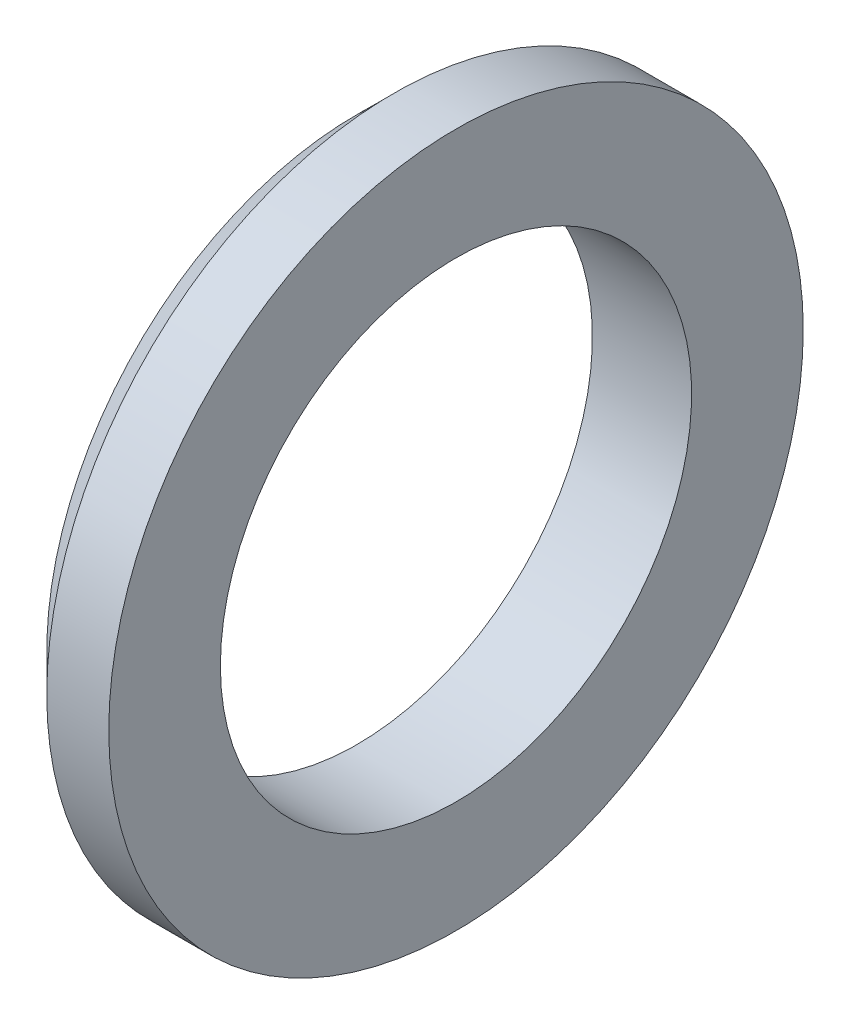
ISO-10303-21;
HEADER;
FILE_DESCRIPTION(('STEP AP214'),'2;1');
FILE_NAME('part.step','',(''),(''),'','','');
FILE_SCHEMA(('AUTOMOTIVE_DESIGN { 1 0 10303 214 1 1 1 1 }'));
ENDSEC;
DATA;
#1=APPLICATION_CONTEXT('core data for automotive mechanical design processes');
#2=APPLICATION_PROTOCOL_DEFINITION('international standard','automotive_design',2000,#1);
#3=PRODUCT_CONTEXT('',#1,'mechanical');
#4=PRODUCT('Part','Part','',(#3));
#5=PRODUCT_RELATED_PRODUCT_CATEGORY('part','',(#4));
#6=PRODUCT_DEFINITION_FORMATION('','',#4);
#7=PRODUCT_DEFINITION_CONTEXT('part definition',#1,'design');
#8=PRODUCT_DEFINITION('design','',#6,#7);
#9=PRODUCT_DEFINITION_SHAPE('','',#8);
#10=(LENGTH_UNIT() NAMED_UNIT(*) SI_UNIT(.MILLI.,.METRE.));
#11=(NAMED_UNIT(*) PLANE_ANGLE_UNIT() SI_UNIT($,.RADIAN.));
#12=(NAMED_UNIT(*) SI_UNIT($,.STERADIAN.) SOLID_ANGLE_UNIT());
#13=UNCERTAINTY_MEASURE_WITH_UNIT(LENGTH_MEASURE(1.E-05),#10,'distance_accuracy_value','');
#14=(GEOMETRIC_REPRESENTATION_CONTEXT(3) GLOBAL_UNCERTAINTY_ASSIGNED_CONTEXT((#13)) GLOBAL_UNIT_ASSIGNED_CONTEXT((#10,
#11,#12)) REPRESENTATION_CONTEXT('',''));
#15=CARTESIAN_POINT('',(0.,0.,0.));
#16=DIRECTION('',(0.,0.,1.));
#17=DIRECTION('',(1.,0.,0.));
#18=AXIS2_PLACEMENT_3D('',#15,#16,#17);
#19=CARTESIAN_POINT('',(-16.9833028512833,0.,0.));
#20=DIRECTION('',(-1.,0.,0.));
#21=DIRECTION('',(0.,0.,1.));
#22=AXIS2_PLACEMENT_3D('',#19,#20,#21);
#23=CYLINDRICAL_SURFACE('',#22,14.);
#24=CARTESIAN_POINT('',(-2.49999999999999,0.,0.));
#25=DIRECTION('',(1.,0.,0.));
#26=DIRECTION('',(0.,0.,-1.));
#27=AXIS2_PLACEMENT_3D('',#24,#25,#26);
#28=CIRCLE('',#27,14.);
#29=CARTESIAN_POINT('',(-2.49999999999999,0.,-14.));
#30=VERTEX_POINT('',#29);
#31=EDGE_CURVE('E10',#30,#30,#28,.T.);
#32=ORIENTED_EDGE('',*,*,#31,.T.);
#33=EDGE_LOOP('',(#32));
#34=FACE_BOUND('',#33,.T.);
#35=CARTESIAN_POINT('',(0.,0.,0.));
#36=DIRECTION('',(-1.,0.,0.));
#37=DIRECTION('',(0.,0.,1.));
#38=AXIS2_PLACEMENT_3D('',#35,#36,#37);
#39=CIRCLE('',#38,14.);
#40=CARTESIAN_POINT('',(0.,0.,14.));
#41=VERTEX_POINT('',#40);
#42=EDGE_CURVE('E54',#41,#41,#39,.T.);
#43=ORIENTED_EDGE('',*,*,#42,.T.);
#44=EDGE_LOOP('',(#43));
#45=FACE_BOUND('',#44,.T.);
#46=ADVANCED_FACE('F34',(#34,#45),#23,.T.);
#47=CARTESIAN_POINT('',(-4.,14.,0.));
#48=DIRECTION('',(1.,0.,0.));
#49=DIRECTION('',(0.,0.,-1.));
#50=AXIS2_PLACEMENT_3D('',#47,#48,#49);
#51=PLANE('',#50);
#52=CARTESIAN_POINT('',(-4.,0.,0.));
#53=DIRECTION('',(1.,0.,0.));
#54=DIRECTION('',(0.,0.,-1.));
#55=AXIS2_PLACEMENT_3D('',#52,#53,#54);
#56=CIRCLE('',#55,12.5);
#57=CARTESIAN_POINT('',(-4.,0.,-12.5));
#58=VERTEX_POINT('',#57);
#59=EDGE_CURVE('E41',#58,#58,#56,.F.);
#60=ORIENTED_EDGE('',*,*,#59,.T.);
#61=EDGE_LOOP('',(#60));
#62=FACE_BOUND('',#61,.T.);
#63=CARTESIAN_POINT('',(-4.,0.,0.));
#64=DIRECTION('',(-1.,0.,0.));
#65=DIRECTION('',(0.,0.,1.));
#66=AXIS2_PLACEMENT_3D('',#63,#64,#65);
#67=CIRCLE('',#66,9.5);
#68=CARTESIAN_POINT('',(-4.,0.,9.5));
#69=VERTEX_POINT('',#68);
#70=EDGE_CURVE('E45',#69,#69,#67,.T.);
#71=ORIENTED_EDGE('',*,*,#70,.F.);
#72=EDGE_LOOP('',(#71));
#73=FACE_BOUND('',#72,.T.);
#74=ADVANCED_FACE('F68',(#62,#73),#51,.F.);
#75=CARTESIAN_POINT('',(-16.9833028512833,0.,0.));
#76=DIRECTION('',(-1.,0.,0.));
#77=DIRECTION('',(0.,0.,1.));
#78=AXIS2_PLACEMENT_3D('',#75,#76,#77);
#79=CYLINDRICAL_SURFACE('',#78,9.5);
#80=CARTESIAN_POINT('',(0.,0.,0.));
#81=DIRECTION('',(-1.,0.,0.));
#82=DIRECTION('',(0.,0.,1.));
#83=AXIS2_PLACEMENT_3D('',#80,#81,#82);
#84=CIRCLE('',#83,9.5);
#85=CARTESIAN_POINT('',(0.,0.,9.5));
#86=VERTEX_POINT('',#85);
#87=EDGE_CURVE('E49',#86,#86,#84,.T.);
#88=ORIENTED_EDGE('',*,*,#87,.F.);
#89=EDGE_LOOP('',(#88));
#90=FACE_BOUND('',#89,.T.);
#91=ORIENTED_EDGE('',*,*,#70,.T.);
#92=EDGE_LOOP('',(#91));
#93=FACE_BOUND('',#92,.T.);
#94=ADVANCED_FACE('F62',(#90,#93),#79,.F.);
#95=CARTESIAN_POINT('',(0.,9.5,0.));
#96=DIRECTION('',(-1.,0.,0.));
#97=DIRECTION('',(0.,0.,1.));
#98=AXIS2_PLACEMENT_3D('',#95,#96,#97);
#99=PLANE('',#98);
#100=ORIENTED_EDGE('',*,*,#42,.F.);
#101=EDGE_LOOP('',(#100));
#102=FACE_BOUND('',#101,.T.);
#103=ORIENTED_EDGE('',*,*,#87,.T.);
#104=EDGE_LOOP('',(#103));
#105=FACE_BOUND('',#104,.T.);
#106=ADVANCED_FACE('F59',(#102,#105),#99,.F.);
#107=CARTESIAN_POINT('',(-4.,0.,0.));
#108=DIRECTION('',(1.,0.,0.));
#109=DIRECTION('',(0.,0.,-1.));
#110=AXIS2_PLACEMENT_3D('',#107,#108,#109);
#111=CONICAL_SURFACE('',#110,12.5,0.785398163397447);
#112=CARTESIAN_POINT('',(-2.49999999999999,0.,-14.));
#113=CARTESIAN_POINT('',(-2.51562499999999,0.,-13.984375));
#114=CARTESIAN_POINT('',(-2.53124999999999,0.,-13.96875));
#115=CARTESIAN_POINT('',(-2.56249999999999,0.,-13.9375));
#116=CARTESIAN_POINT('',(-2.57812499999999,0.,-13.921875));
#117=CARTESIAN_POINT('',(-2.60937499999999,0.,-13.890625));
#118=CARTESIAN_POINT('',(-2.62499999999999,0.,-13.875));
#119=CARTESIAN_POINT('',(-2.65624999999999,0.,-13.84375));
#120=CARTESIAN_POINT('',(-2.67187499999999,0.,-13.828125));
#121=CARTESIAN_POINT('',(-2.70312499999999,0.,-13.796875));
#122=CARTESIAN_POINT('',(-2.71874999999999,0.,-13.78125));
#123=CARTESIAN_POINT('',(-2.74999999999999,0.,-13.75));
#124=CARTESIAN_POINT('',(-2.76562499999999,0.,-13.734375));
#125=CARTESIAN_POINT('',(-2.79687499999999,0.,-13.703125));
#126=CARTESIAN_POINT('',(-2.81249999999999,0.,-13.6875));
#127=CARTESIAN_POINT('',(-2.84374999999999,0.,-13.65625));
#128=CARTESIAN_POINT('',(-2.85937499999999,0.,-13.640625));
#129=CARTESIAN_POINT('',(-2.89062499999999,0.,-13.609375));
#130=CARTESIAN_POINT('',(-2.90624999999999,0.,-13.59375));
#131=CARTESIAN_POINT('',(-2.93749999999999,0.,-13.5625));
#132=CARTESIAN_POINT('',(-2.95312499999999,0.,-13.546875));
#133=CARTESIAN_POINT('',(-2.98437499999999,0.,-13.515625));
#134=CARTESIAN_POINT('',(-2.99999999999999,0.,-13.5));
#135=CARTESIAN_POINT('',(-3.03124999999999,0.,-13.46875));
#136=CARTESIAN_POINT('',(-3.04687499999999,0.,-13.453125));
#137=CARTESIAN_POINT('',(-3.07812499999999,0.,-13.421875));
#138=CARTESIAN_POINT('',(-3.09374999999999,0.,-13.40625));
#139=CARTESIAN_POINT('',(-3.12499999999999,0.,-13.375));
#140=CARTESIAN_POINT('',(-3.14062499999999,0.,-13.359375));
#141=CARTESIAN_POINT('',(-3.17187499999999,0.,-13.328125));
#142=CARTESIAN_POINT('',(-3.18749999999999,0.,-13.3125));
#143=CARTESIAN_POINT('',(-3.21874999999999,0.,-13.28125));
#144=CARTESIAN_POINT('',(-3.23437499999999,0.,-13.265625));
#145=CARTESIAN_POINT('',(-3.26562499999999,0.,-13.234375));
#146=CARTESIAN_POINT('',(-3.28125,0.,-13.21875));
#147=CARTESIAN_POINT('',(-3.3125,0.,-13.1875));
#148=CARTESIAN_POINT('',(-3.328125,0.,-13.171875));
#149=CARTESIAN_POINT('',(-3.359375,0.,-13.140625));
#150=CARTESIAN_POINT('',(-3.375,0.,-13.125));
#151=CARTESIAN_POINT('',(-3.40625,0.,-13.09375));
#152=CARTESIAN_POINT('',(-3.421875,0.,-13.078125));
#153=CARTESIAN_POINT('',(-3.453125,0.,-13.046875));
#154=CARTESIAN_POINT('',(-3.46875,0.,-13.03125));
#155=CARTESIAN_POINT('',(-3.5,0.,-13.));
#156=CARTESIAN_POINT('',(-3.515625,0.,-12.984375));
#157=CARTESIAN_POINT('',(-3.546875,0.,-12.953125));
#158=CARTESIAN_POINT('',(-3.5625,0.,-12.9375));
#159=CARTESIAN_POINT('',(-3.59375,0.,-12.90625));
#160=CARTESIAN_POINT('',(-3.609375,0.,-12.890625));
#161=CARTESIAN_POINT('',(-3.640625,0.,-12.859375));
#162=CARTESIAN_POINT('',(-3.65625,0.,-12.84375));
#163=CARTESIAN_POINT('',(-3.6875,0.,-12.8125));
#164=CARTESIAN_POINT('',(-3.703125,0.,-12.796875));
#165=CARTESIAN_POINT('',(-3.734375,0.,-12.765625));
#166=CARTESIAN_POINT('',(-3.75,0.,-12.75));
#167=CARTESIAN_POINT('',(-3.78125,0.,-12.71875));
#168=CARTESIAN_POINT('',(-3.796875,0.,-12.703125));
#169=CARTESIAN_POINT('',(-3.828125,0.,-12.671875));
#170=CARTESIAN_POINT('',(-3.84375,0.,-12.65625));
#171=CARTESIAN_POINT('',(-3.875,0.,-12.625));
#172=CARTESIAN_POINT('',(-3.890625,0.,-12.609375));
#173=CARTESIAN_POINT('',(-3.921875,0.,-12.578125));
#174=CARTESIAN_POINT('',(-3.9375,0.,-12.5625));
#175=CARTESIAN_POINT('',(-3.96875,0.,-12.53125));
#176=CARTESIAN_POINT('',(-3.984375,0.,-12.515625));
#177=CARTESIAN_POINT('',(-4.,0.,-12.5));
#178=B_SPLINE_CURVE_WITH_KNOTS('',3,(#112,#113,#114,#115,#116,#117,#118,#119,#120,#121,#122,
#123,#124,#125,#126,#127,#128,#129,#130,#131,#132,#133,#134,#135,#136,#137,#138,#139,#140,#141,
#142,#143,#144,#145,#146,#147,#148,#149,#150,#151,#152,#153,#154,#155,#156,#157,#158,#159,#160,
#161,#162,#163,#164,#165,#166,#167,#168,#169,#170,#171,#172,#173,#174,#175,#176,#177),
.UNSPECIFIED.,.F.,.F.,(4,2,2,2,2,2,2,2,2,2,2,2,2,2,2,2,2,2,2,2,2,2,2,2,2,2,2,2,2,2,2,2,4),(0.,
0.0662912607362395,0.132582521472478,0.198873782208718,0.265165042944957,0.331456303681196,
0.397747564417436,0.464038825153675,0.530330085889914,0.596621346626154,0.662912607362393,
0.729203868098632,0.795495128834871,0.86178638957111,0.928077650307349,0.99436891104359,
1.06066017177983,1.12695143251607,1.19324269325231,1.25953395398855,1.32582521472479,
1.39211647546102,1.45840773619726,1.5246989969335,1.59099025766974,1.65728151840598,
1.72357277914222,1.78986403987846,1.8561553006147,1.92244656135094,1.98873782208718,
2.05502908282342,2.12132034355966),.UNSPECIFIED.);
#179=EDGE_CURVE('BSEAM36',#30,#58,#178,.T.);
#180=ORIENTED_EDGE('',*,*,#31,.F.);
#181=ORIENTED_EDGE('',*,*,#59,.F.);
#182=ORIENTED_EDGE('',*,*,#179,.T.);
#183=ORIENTED_EDGE('',*,*,#179,.F.);
#184=EDGE_LOOP('',(#180,#182,#181,#183));
#185=FACE_BOUND('',#184,.T.);
#186=ADVANCED_FACE('F36',(#185),#111,.T.);
#187=CLOSED_SHELL('',(#46,#74,#94,#106,#186));
#188=MANIFOLD_SOLID_BREP('B2',#187);
#189=ADVANCED_BREP_SHAPE_REPRESENTATION('',(#18,#188),#14);
#190=SHAPE_DEFINITION_REPRESENTATION(#9,#189);
ENDSEC;
END-ISO-10303-21;
